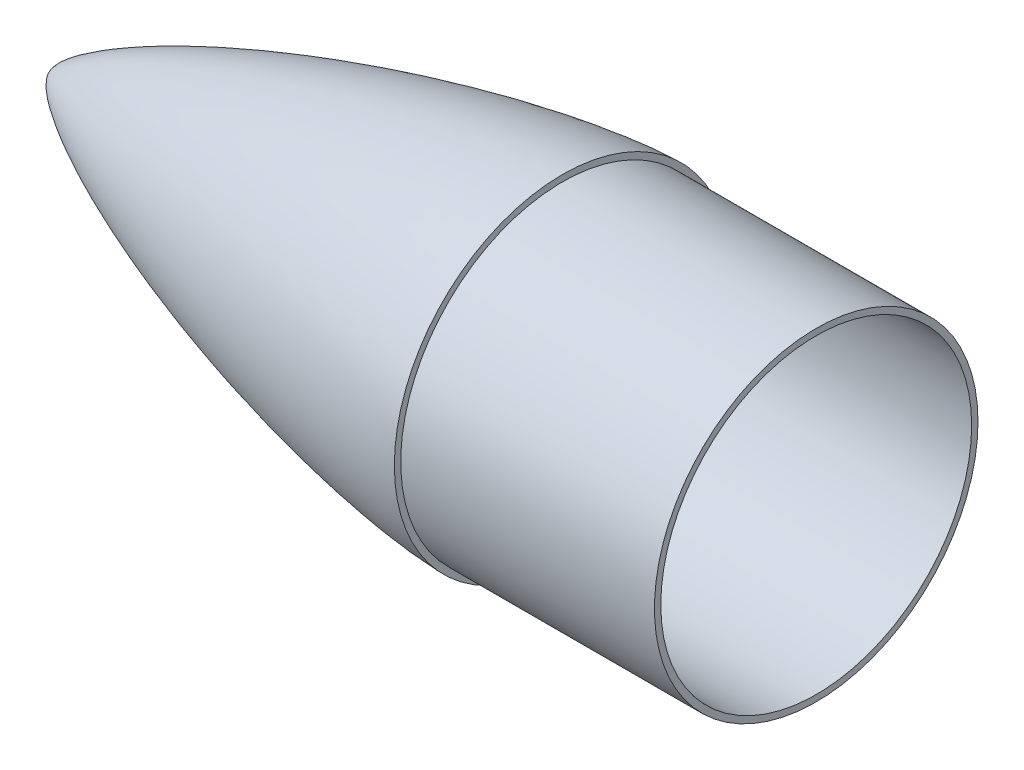
ISO-10303-21;
HEADER;
FILE_DESCRIPTION(('STEP AP214'),'2;1');
FILE_NAME('part.step','',(''),(''),'','','');
FILE_SCHEMA(('AUTOMOTIVE_DESIGN { 1 0 10303 214 1 1 1 1 }'));
ENDSEC;
DATA;
#1=APPLICATION_CONTEXT('core data for automotive mechanical design processes');
#2=APPLICATION_PROTOCOL_DEFINITION('international standard','automotive_design',2000,#1);
#3=PRODUCT_CONTEXT('',#1,'mechanical');
#4=PRODUCT('Part','Part','',(#3));
#5=PRODUCT_RELATED_PRODUCT_CATEGORY('part','',(#4));
#6=PRODUCT_DEFINITION_FORMATION('','',#4);
#7=PRODUCT_DEFINITION_CONTEXT('part definition',#1,'design');
#8=PRODUCT_DEFINITION('design','',#6,#7);
#9=PRODUCT_DEFINITION_SHAPE('','',#8);
#10=(LENGTH_UNIT() NAMED_UNIT(*) SI_UNIT(.MILLI.,.METRE.));
#11=(NAMED_UNIT(*) PLANE_ANGLE_UNIT() SI_UNIT($,.RADIAN.));
#12=(NAMED_UNIT(*) SI_UNIT($,.STERADIAN.) SOLID_ANGLE_UNIT());
#13=UNCERTAINTY_MEASURE_WITH_UNIT(LENGTH_MEASURE(1.E-05),#10,'distance_accuracy_value','');
#14=(GEOMETRIC_REPRESENTATION_CONTEXT(3) GLOBAL_UNCERTAINTY_ASSIGNED_CONTEXT((#13)) GLOBAL_UNIT_ASSIGNED_CONTEXT((#10,
#11,#12)) REPRESENTATION_CONTEXT('',''));
#15=CARTESIAN_POINT('',(0.,0.,0.));
#16=DIRECTION('',(0.,0.,1.));
#17=DIRECTION('',(1.,0.,0.));
#18=AXIS2_PLACEMENT_3D('',#15,#16,#17);
#19=CARTESIAN_POINT('',(20.,0.,0.));
#20=DIRECTION('',(-1.,0.,0.));
#21=DIRECTION('',(0.,0.,1.));
#22=AXIS2_PLACEMENT_3D('',#19,#20,#21);
#23=CYLINDRICAL_SURFACE('',#22,12.75);
#24=CARTESIAN_POINT('',(20.,0.,0.));
#25=DIRECTION('',(1.,0.,0.));
#26=DIRECTION('',(0.,0.,-1.));
#27=AXIS2_PLACEMENT_3D('',#24,#25,#26);
#28=CIRCLE('',#27,12.75);
#29=CARTESIAN_POINT('',(20.,0.,-12.75));
#30=VERTEX_POINT('',#29);
#31=EDGE_CURVE('E12',#30,#30,#28,.T.);
#32=ORIENTED_EDGE('',*,*,#31,.F.);
#33=EDGE_LOOP('',(#32));
#34=FACE_BOUND('',#33,.T.);
#35=CARTESIAN_POINT('',(0.,0.,0.));
#36=DIRECTION('',(1.,0.,0.));
#37=DIRECTION('',(0.,0.,-1.));
#38=AXIS2_PLACEMENT_3D('',#35,#36,#37);
#39=CIRCLE('',#38,12.75);
#40=CARTESIAN_POINT('',(0.,0.,-12.75));
#41=VERTEX_POINT('',#40);
#42=EDGE_CURVE('E88',#41,#41,#39,.T.);
#43=ORIENTED_EDGE('',*,*,#42,.T.);
#44=EDGE_LOOP('',(#43));
#45=FACE_BOUND('',#44,.T.);
#46=ADVANCED_FACE('F85',(#34,#45),#23,.T.);
#47=CARTESIAN_POINT('',(20.,0.,0.));
#48=DIRECTION('',(1.,0.,0.));
#49=DIRECTION('',(0.,0.,-1.));
#50=AXIS2_PLACEMENT_3D('',#47,#48,#49);
#51=PLANE('',#50);
#52=CARTESIAN_POINT('',(20.,0.,0.));
#53=DIRECTION('',(1.,0.,0.));
#54=DIRECTION('',(0.,0.,-1.));
#55=AXIS2_PLACEMENT_3D('',#52,#53,#54);
#56=CIRCLE('',#55,12.25);
#57=CARTESIAN_POINT('',(20.,0.,-12.25));
#58=VERTEX_POINT('',#57);
#59=EDGE_CURVE('E99',#58,#58,#56,.T.);
#60=ORIENTED_EDGE('',*,*,#59,.F.);
#61=EDGE_LOOP('',(#60));
#62=FACE_BOUND('',#61,.T.);
#63=ORIENTED_EDGE('',*,*,#31,.T.);
#64=EDGE_LOOP('',(#63));
#65=FACE_BOUND('',#64,.T.);
#66=ADVANCED_FACE('F106',(#62,#65),#51,.T.);
#67=CARTESIAN_POINT('',(0.,0.,0.));
#68=DIRECTION('',(1.,0.,0.));
#69=DIRECTION('',(0.,0.,-1.));
#70=AXIS2_PLACEMENT_3D('',#67,#68,#69);
#71=PLANE('',#70);
#72=CARTESIAN_POINT('',(0.,0.,0.));
#73=DIRECTION('',(1.,0.,0.));
#74=DIRECTION('',(0.,0.,-1.));
#75=AXIS2_PLACEMENT_3D('',#72,#73,#74);
#76=CIRCLE('',#75,12.25);
#77=CARTESIAN_POINT('',(0.,0.,-12.25));
#78=VERTEX_POINT('',#77);
#79=EDGE_CURVE('E95',#78,#78,#76,.F.);
#80=ORIENTED_EDGE('',*,*,#79,.F.);
#81=EDGE_LOOP('',(#80));
#82=FACE_BOUND('',#81,.T.);
#83=ORIENTED_EDGE('',*,*,#42,.F.);
#84=EDGE_LOOP('',(#83));
#85=FACE_BOUND('',#84,.T.);
#86=ADVANCED_FACE('F108',(#82,#85),#71,.F.);
#87=CARTESIAN_POINT('',(-40.0930989130625,0.,0.));
#88=DIRECTION('',(1.,0.,0.));
#89=DIRECTION('',(0.,0.,-1.));
#90=AXIS2_PLACEMENT_3D('',#87,#88,#89);
#91=CYLINDRICAL_SURFACE('',#90,12.25);
#92=CARTESIAN_POINT('',(20.,0.,-12.25));
#93=CARTESIAN_POINT('',(19.7916666666667,0.,-12.25));
#94=CARTESIAN_POINT('',(19.5833333333333,0.,-12.25));
#95=CARTESIAN_POINT('',(19.1666666666667,0.,-12.25));
#96=CARTESIAN_POINT('',(18.9583333333333,0.,-12.25));
#97=CARTESIAN_POINT('',(18.5416666666667,0.,-12.25));
#98=CARTESIAN_POINT('',(18.3333333333333,0.,-12.25));
#99=CARTESIAN_POINT('',(17.9166666666667,0.,-12.25));
#100=CARTESIAN_POINT('',(17.7083333333333,0.,-12.25));
#101=CARTESIAN_POINT('',(17.2916666666667,0.,-12.25));
#102=CARTESIAN_POINT('',(17.0833333333333,0.,-12.25));
#103=CARTESIAN_POINT('',(16.6666666666667,0.,-12.25));
#104=CARTESIAN_POINT('',(16.4583333333333,0.,-12.25));
#105=CARTESIAN_POINT('',(16.0416666666667,0.,-12.25));
#106=CARTESIAN_POINT('',(15.8333333333333,0.,-12.25));
#107=CARTESIAN_POINT('',(15.4166666666667,0.,-12.25));
#108=CARTESIAN_POINT('',(15.2083333333333,0.,-12.25));
#109=CARTESIAN_POINT('',(14.7916666666667,0.,-12.25));
#110=CARTESIAN_POINT('',(14.5833333333333,0.,-12.25));
#111=CARTESIAN_POINT('',(14.1666666666667,0.,-12.25));
#112=CARTESIAN_POINT('',(13.9583333333333,0.,-12.25));
#113=CARTESIAN_POINT('',(13.5416666666667,0.,-12.25));
#114=CARTESIAN_POINT('',(13.3333333333333,0.,-12.25));
#115=CARTESIAN_POINT('',(12.9166666666667,0.,-12.25));
#116=CARTESIAN_POINT('',(12.7083333333333,0.,-12.25));
#117=CARTESIAN_POINT('',(12.2916666666667,0.,-12.25));
#118=CARTESIAN_POINT('',(12.0833333333333,0.,-12.25));
#119=CARTESIAN_POINT('',(11.6666666666667,0.,-12.25));
#120=CARTESIAN_POINT('',(11.4583333333333,0.,-12.25));
#121=CARTESIAN_POINT('',(11.0416666666667,0.,-12.25));
#122=CARTESIAN_POINT('',(10.8333333333333,0.,-12.25));
#123=CARTESIAN_POINT('',(10.4166666666667,0.,-12.25));
#124=CARTESIAN_POINT('',(10.2083333333333,0.,-12.25));
#125=CARTESIAN_POINT('',(9.79166666666666,0.,-12.25));
#126=CARTESIAN_POINT('',(9.58333333333333,0.,-12.25));
#127=CARTESIAN_POINT('',(9.16666666666666,0.,-12.25));
#128=CARTESIAN_POINT('',(8.95833333333333,0.,-12.25));
#129=CARTESIAN_POINT('',(8.54166666666666,0.,-12.25));
#130=CARTESIAN_POINT('',(8.33333333333333,0.,-12.25));
#131=CARTESIAN_POINT('',(7.91666666666666,0.,-12.25));
#132=CARTESIAN_POINT('',(7.70833333333333,0.,-12.25));
#133=CARTESIAN_POINT('',(7.29166666666666,0.,-12.25));
#134=CARTESIAN_POINT('',(7.08333333333333,0.,-12.25));
#135=CARTESIAN_POINT('',(6.66666666666666,0.,-12.25));
#136=CARTESIAN_POINT('',(6.45833333333333,0.,-12.25));
#137=CARTESIAN_POINT('',(6.04166666666667,0.,-12.25));
#138=CARTESIAN_POINT('',(5.83333333333333,0.,-12.25));
#139=CARTESIAN_POINT('',(5.41666666666666,0.,-12.25));
#140=CARTESIAN_POINT('',(5.20833333333333,0.,-12.25));
#141=CARTESIAN_POINT('',(4.79166666666666,0.,-12.25));
#142=CARTESIAN_POINT('',(4.58333333333333,0.,-12.25));
#143=CARTESIAN_POINT('',(4.16666666666666,0.,-12.25));
#144=CARTESIAN_POINT('',(3.95833333333333,0.,-12.25));
#145=CARTESIAN_POINT('',(3.54166666666666,0.,-12.25));
#146=CARTESIAN_POINT('',(3.33333333333333,0.,-12.25));
#147=CARTESIAN_POINT('',(2.91666666666666,0.,-12.25));
#148=CARTESIAN_POINT('',(2.70833333333333,0.,-12.25));
#149=CARTESIAN_POINT('',(2.29166666666666,0.,-12.25));
#150=CARTESIAN_POINT('',(2.08333333333333,0.,-12.25));
#151=CARTESIAN_POINT('',(1.66666666666666,0.,-12.25));
#152=CARTESIAN_POINT('',(1.45833333333333,0.,-12.25));
#153=CARTESIAN_POINT('',(1.04166666666666,0.,-12.25));
#154=CARTESIAN_POINT('',(0.833333333333327,0.,-12.25));
#155=CARTESIAN_POINT('',(0.41666666666666,0.,-12.25));
#156=CARTESIAN_POINT('',(0.208333333333327,0.,-12.25));
#157=CARTESIAN_POINT('',(0.,0.,-12.25));
#158=B_SPLINE_CURVE_WITH_KNOTS('',3,(#92,#93,#94,#95,#96,#97,#98,#99,#100,#101,#102,#103,#104,
#105,#106,#107,#108,#109,#110,#111,#112,#113,#114,#115,#116,#117,#118,#119,#120,#121,#122,#123,
#124,#125,#126,#127,#128,#129,#130,#131,#132,#133,#134,#135,#136,#137,#138,#139,#140,#141,#142,
#143,#144,#145,#146,#147,#148,#149,#150,#151,#152,#153,#154,#155,#156,#157),.UNSPECIFIED.,.F.,
.F.,(4,2,2,2,2,2,2,2,2,2,2,2,2,2,2,2,2,2,2,2,2,2,2,2,2,2,2,2,2,2,2,2,4),(0.,0.625000000000001,
1.25,1.875,2.5,3.125,3.75,4.375,5.,5.62500000000001,6.25,6.875,7.5,8.125,8.75,9.375,10.,10.625,
11.25,11.875,12.5,13.125,13.75,14.375,15.,15.625,16.25,16.875,17.5,18.125,18.75,19.375,20.),.UNSPECIFIED.);
#159=EDGE_CURVE('BSEAM103',#58,#78,#158,.T.);
#160=ORIENTED_EDGE('',*,*,#59,.T.);
#161=ORIENTED_EDGE('',*,*,#79,.T.);
#162=ORIENTED_EDGE('',*,*,#159,.T.);
#163=ORIENTED_EDGE('',*,*,#159,.F.);
#164=EDGE_LOOP('',(#160,#162,#161,#163));
#165=FACE_BOUND('',#164,.T.);
#166=ADVANCED_FACE('F103',(#165),#91,.F.);
#167=CLOSED_SHELL('',(#46,#66,#86,#166));
#168=MANIFOLD_SOLID_BREP('B2',#167);
#169=CARTESIAN_POINT('',(-39.6100452831368,0.,0.));
#170=DIRECTION('',(1.,0.,0.));
#171=DIRECTION('',(0.,0.,-1.));
#172=AXIS2_PLACEMENT_3D('',#169,#170,#171);
#173=PLANE('',#172);
#174=CARTESIAN_POINT('',(-39.6100452831368,0.,0.));
#175=DIRECTION('',(1.,0.,0.));
#176=DIRECTION('',(0.,0.,-1.));
#177=AXIS2_PLACEMENT_3D('',#174,#175,#176);
#178=CIRCLE('',#177,0.338657604575159);
#179=CARTESIAN_POINT('',(-39.6100452831368,-0.146307802492929,-0.305422658076107));
#180=VERTEX_POINT('',#179);
#181=EDGE_CURVE('E84',#180,#180,#178,.T.);
#182=ORIENTED_EDGE('',*,*,#181,.T.);
#183=EDGE_LOOP('',(#182));
#184=FACE_BOUND('',#183,.T.);
#185=ADVANCED_FACE('F155',(#184),#173,.T.);
#186=CARTESIAN_POINT('',(-40.0803879721741,0.,0.));
#187=DIRECTION('',(1.,0.,0.));
#188=DIRECTION('',(0.,0.,-1.));
#189=AXIS2_PLACEMENT_3D('',#186,#187,#188);
#190=PLANE('',#189);
#191=CARTESIAN_POINT('',(-40.0803879721741,0.,0.));
#192=DIRECTION('',(1.,0.,0.));
#193=DIRECTION('',(0.,0.,-1.));
#194=AXIS2_PLACEMENT_3D('',#191,#192,#193);
#195=CIRCLE('',#194,0.500000000000001);
#196=CARTESIAN_POINT('',(-40.0803879721741,-0.335109697039272,-0.371081515236542));
#197=VERTEX_POINT('',#196);
#198=EDGE_CURVE('E163',#197,#197,#195,.T.);
#199=ORIENTED_EDGE('',*,*,#198,.F.);
#200=EDGE_LOOP('',(#199));
#201=FACE_BOUND('',#200,.T.);
#202=ADVANCED_FACE('F186',(#201),#190,.F.);
#203=CARTESIAN_POINT('',(-40.0803879721741,-0.335109697039272,-0.371081515236542));
#204=CARTESIAN_POINT('',(-40.1033067329983,-0.261435937402248,-0.289499362883331));
#205=CARTESIAN_POINT('',(-39.8566760080675,-0.203871869947589,-0.297461010479719));
#206=CARTESIAN_POINT('',(-39.6100452831368,-0.146307802492929,-0.305422658076107));
#207=CARTESIAN_POINT('',(-40.0803879721741,-0.32486942413107,-0.38032911882488));
#208=CARTESIAN_POINT('',(-40.1033072209954,-0.253416850845813,-0.296736045681893));
#209=CARTESIAN_POINT('',(-39.8566762520661,-0.195648142935301,-0.303098088685618));
#210=CARTESIAN_POINT('',(-39.6100452831368,-0.137879435024789,-0.309460131689342));
#211=CARTESIAN_POINT('',(-40.0803879721741,-0.30383073719376,-0.397818973483722));
#212=CARTESIAN_POINT('',(-40.1033103155206,-0.236923140608411,-0.310430673664126));
#213=CARTESIAN_POINT('',(-39.8566777993287,-0.178888304624512,-0.313602760163096));
#214=CARTESIAN_POINT('',(-39.6100452831368,-0.120853468640614,-0.316774846662065));
#215=CARTESIAN_POINT('',(-40.0803879721741,-0.270780615801149,-0.421046985526386));
#216=CARTESIAN_POINT('',(-40.1033102959687,-0.211154560421565,-0.328535309406903));
#217=CARTESIAN_POINT('',(-39.8566777895528,-0.153039008992214,-0.327021306913354));
#218=CARTESIAN_POINT('',(-39.6100452831368,-0.0949234575628625,-0.325507304419805));
#219=CARTESIAN_POINT('',(-40.0803879721741,-0.236420735797964,-0.441277515231353));
#220=CARTESIAN_POINT('',(-40.1033094809521,-0.184403532048194,-0.34429455999992));
#221=CARTESIAN_POINT('',(-39.8566773820445,-0.126561274937004,-0.338167894768014));
#222=CARTESIAN_POINT('',(-39.6100452831368,-0.0687190178258141,-0.332041229536107));
#223=CARTESIAN_POINT('',(-40.0803879721741,-0.0234968983718139,-0.544731525082386));
#224=CARTESIAN_POINT('',(-40.1032981416511,-0.0186868817919445,-0.424786635055151));
#225=CARTESIAN_POINT('',(-39.856671712394,0.0353837568535826,-0.391543355899931));
#226=CARTESIAN_POINT('',(-39.6100452831368,0.0894543954991096,-0.35830007674471));
#227=CARTESIAN_POINT('',(-40.0803879721741,0.223119857823136,-0.498954063570516));
#228=CARTESIAN_POINT('',(-40.1033060268777,0.172113591578821,-0.391653447522024));
#229=CARTESIAN_POINT('',(-39.8566756550073,0.206468335921579,-0.336407564752602));
#230=CARTESIAN_POINT('',(-39.6100452831368,0.240823080264337,-0.28116168198318));
#231=CARTESIAN_POINT('',(-40.0803879721741,0.46355755111992,-0.232706967957245));
#232=CARTESIAN_POINT('',(-40.103307804415,0.362881368925774,-0.180027878835511));
#233=CARTESIAN_POINT('',(-39.8566765437759,0.354339381567118,-0.121026003323516));
#234=CARTESIAN_POINT('',(-39.6100452831368,0.345797394208463,-0.0620241278115222));
#235=CARTESIAN_POINT('',(-40.0803879721741,0.547974371103313,0.0279126022972836));
#236=CARTESIAN_POINT('',(-40.1033042283759,0.426252178401426,0.021612043039057));
#237=CARTESIAN_POINT('',(-39.8566747557563,0.388387909749853,0.0725392046898485));
#238=CARTESIAN_POINT('',(-39.6100452831368,0.350523641098281,0.12346636634064));
#239=CARTESIAN_POINT('',(-40.0803879721741,0.4375124261213,0.278605479353163));
#240=CARTESIAN_POINT('',(-40.1033076379422,0.342510636709201,0.216294453154176));
#241=CARTESIAN_POINT('',(-39.8566764605395,0.286551056941769,0.240671187548963));
#242=CARTESIAN_POINT('',(-39.6100452831368,0.230591477174336,0.265047921943751));
#243=CARTESIAN_POINT('',(-40.0803879721741,0.232706967957245,0.46355755111992));
#244=CARTESIAN_POINT('',(-40.1033082963639,0.180274481026224,0.362766668015282));
#245=CARTESIAN_POINT('',(-39.8566767897504,0.121149304418873,0.354282031111872));
#246=CARTESIAN_POINT('',(-39.6100452831368,0.0620241278115222,0.345797394208463));
#247=CARTESIAN_POINT('',(-40.0803879721741,-0.0279126022972836,0.547974371103313));
#248=CARTESIAN_POINT('',(-40.1033062036409,-0.0219268875559384,0.426234241128132));
#249=CARTESIAN_POINT('',(-39.8566757433889,-0.0726966269482891,0.388378941113206));
#250=CARTESIAN_POINT('',(-39.6100452831368,-0.12346636634064,0.350523641098281));
#251=CARTESIAN_POINT('',(-40.0803879721741,-0.278605479353163,0.4375124261213));
#252=CARTESIAN_POINT('',(-40.1033067869025,-0.216065200012035,0.342636128329514));
#253=CARTESIAN_POINT('',(-39.8566760350197,-0.240556560977893,0.286613802751925));
#254=CARTESIAN_POINT('',(-39.6100452831368,-0.265047921943751,0.230591477174336));
#255=CARTESIAN_POINT('',(-40.0803879721741,-0.519043172649947,0.171265330508029));
#256=CARTESIAN_POINT('',(-40.1033120188757,-0.407130066534461,0.131326541075574));
#257=CARTESIAN_POINT('',(-39.8566786510063,-0.388576151211169,0.0713902320391261));
#258=CARTESIAN_POINT('',(-39.6100452831368,-0.370022235887877,0.0114539230026781));
#259=CARTESIAN_POINT('',(-40.0803879721741,-0.539524491226316,-0.0787265013744624));
#260=CARTESIAN_POINT('',(-40.1033201199947,-0.420591787450124,-0.0618063383654696));
#261=CARTESIAN_POINT('',(-39.8566827015658,-0.377929744126575,-0.108325069617348));
#262=CARTESIAN_POINT('',(-39.6100452831368,-0.335267700803026,-0.154843800869227));
#263=CARTESIAN_POINT('',(-40.0803879721741,-0.414970346067824,-0.280036107758193));
#264=CARTESIAN_POINT('',(-40.1033095700569,-0.323713938258788,-0.21852163041772));
#265=CARTESIAN_POINT('',(-39.8566774265968,-0.269695072809157,-0.24008269325474));
#266=CARTESIAN_POINT('',(-39.6100452831368,-0.215676207359527,-0.261643756091761));
#267=CARTESIAN_POINT('',(-40.0803879721741,-0.391353153655575,-0.312162481791682));
#268=CARTESIAN_POINT('',(-40.1033073941156,-0.305334374570618,-0.243526274676344));
#269=CARTESIAN_POINT('',(-39.8566763386262,-0.249748182306675,-0.260747479665809));
#270=CARTESIAN_POINT('',(-39.6100452831368,-0.194161990042732,-0.277968684655273));
#271=CARTESIAN_POINT('',(-40.0803879721741,-0.36488708063206,-0.342681296418637));
#272=CARTESIAN_POINT('',(-40.1033073875378,-0.284652365936106,-0.267358521337697));
#273=CARTESIAN_POINT('',(-39.8566763353373,-0.227879459489534,-0.280030218870357));
#274=CARTESIAN_POINT('',(-39.6100452831368,-0.171106553042963,-0.292701916403016));
#275=CARTESIAN_POINT('',(-40.0803879721741,-0.345349969947475,-0.361833911648204));
#276=CARTESIAN_POINT('',(-40.1033062450011,-0.269455023958683,-0.282262680084769));
#277=CARTESIAN_POINT('',(-39.856675764069,-0.212095596959876,-0.29182393227382));
#278=CARTESIAN_POINT('',(-39.6100452831368,-0.15473616996107,-0.301385184462871));
#279=CARTESIAN_POINT('',(-40.0803879721741,-0.335109697039272,-0.371081515236542));
#280=CARTESIAN_POINT('',(-40.1033067329983,-0.261435937402248,-0.289499362883331));
#281=CARTESIAN_POINT('',(-39.8566760080675,-0.203871869947589,-0.297461010479719));
#282=CARTESIAN_POINT('',(-39.6100452831368,-0.146307802492929,-0.305422658076107));
#283=B_SPLINE_SURFACE_WITH_KNOTS('',3,3,((#203,#204,#205,#206),(#207,#208,#209,#210),(#211,#212,
#213,#214),(#215,#216,#217,#218),(#219,#220,#221,#222),(#223,#224,#225,#226),(#227,#228,#229,
#230),(#231,#232,#233,#234),(#235,#236,#237,#238),(#239,#240,#241,#242),(#243,#244,#245,#246),
(#247,#248,#249,#250),(#251,#252,#253,#254),(#255,#256,#257,#258),(#259,#260,#261,#262),(#263,
#264,#265,#266),(#267,#268,#269,#270),(#271,#272,#273,#274),(#275,#276,#277,#278),(#279,#280,
#281,#282)),.UNSPECIFIED.,.T.,.F.,.F.,(4,1,1,1,1,2,1,2,1,2,1,1,1,1,4),(4,4),(0.,0.0125,
0.0249999999999999,0.0375000000000001,0.05,0.25,0.375,0.5,0.625,0.75,0.95,0.9625,0.975,0.9875,
1.),(0.,1.),.UNSPECIFIED.);
#284=CARTESIAN_POINT('',(-40.0803879721741,-0.335109697039272,-0.371081515236542));
#285=CARTESIAN_POINT('',(-40.0805654460272,-0.334539241114293,-0.370449820862224));
#286=CARTESIAN_POINT('',(-40.0807283436539,-0.333964569885281,-0.369817765125724));
#287=CARTESIAN_POINT('',(-40.0810209643011,-0.332817048447248,-0.368564508800024));
#288=CARTESIAN_POINT('',(-40.0811512023178,-0.33224433214934,-0.367943305611579));
#289=CARTESIAN_POINT('',(-40.0813787777868,-0.331100701367863,-0.36671166045326));
#290=CARTESIAN_POINT('',(-40.0814766011927,-0.330529900618531,-0.366101203114935));
#291=CARTESIAN_POINT('',(-40.0816396380271,-0.329390113167751,-0.364890983406496));
#292=CARTESIAN_POINT('',(-40.0817053030764,-0.328821219848816,-0.364291194153796));
#293=CARTESIAN_POINT('',(-40.0818043159467,-0.327685250838308,-0.363102234926807));
#294=CARTESIAN_POINT('',(-40.0818380762489,-0.327118249132344,-0.362513028835564));
#295=CARTESIAN_POINT('',(-40.0818735779394,-0.32598606810286,-0.361345159935872));
#296=CARTESIAN_POINT('',(-40.081875688244,-0.325420944677883,-0.360766454315583));
#297=CARTESIAN_POINT('',(-40.0818481923415,-0.324292522913487,-0.359619507154919));
#298=CARTESIAN_POINT('',(-40.0818189076906,-0.323729264224463,-0.359051219017802));
#299=CARTESIAN_POINT('',(-40.0817289279378,-0.322604572795352,-0.357925024746919));
#300=CARTESIAN_POINT('',(-40.0816685040166,-0.322043165736695,-0.357367071380433));
#301=CARTESIAN_POINT('',(-40.0815165545277,-0.320922175960799,-0.356261461302748));
#302=CARTESIAN_POINT('',(-40.0814252476734,-0.320362607614126,-0.355713760009179));
#303=CARTESIAN_POINT('',(-40.0812118429062,-0.319245290869468,-0.354628565396462));
#304=CARTESIAN_POINT('',(-40.0810899101701,-0.318687548469033,-0.354091033440664));
#305=CARTESIAN_POINT('',(-40.0808155649417,-0.317573876168019,-0.353026085502496));
#306=CARTESIAN_POINT('',(-40.0806632640944,-0.317017946994561,-0.352498640001869));
#307=CARTESIAN_POINT('',(-40.0803284935631,-0.315907890510763,-0.351453769815638));
#308=CARTESIAN_POINT('',(-40.0801460830694,-0.315353761798144,-0.350936327651497));
#309=CARTESIAN_POINT('',(-40.0797514027034,-0.314247292406134,-0.349911366109238));
#310=CARTESIAN_POINT('',(-40.0795391416607,-0.313694951247235,-0.349403843847205));
#311=CARTESIAN_POINT('',(-40.0790850671916,-0.312592040064624,-0.348398621609047));
#312=CARTESIAN_POINT('',(-40.0788432152392,-0.31204147332857,-0.347900935438938));
#313=CARTESIAN_POINT('',(-40.0783302626035,-0.310942091267775,-0.346915282899512));
#314=CARTESIAN_POINT('',(-40.0780590798101,-0.310393285532457,-0.346427348596848));
#315=CARTESIAN_POINT('',(-40.0774877650841,-0.30929740326379,-0.345461095865207));
#316=CARTESIAN_POINT('',(-40.0771875118218,-0.308750344767706,-0.34498282877598));
#317=CARTESIAN_POINT('',(-40.0765583511543,-0.307657932695547,-0.344035805669539));
#318=CARTESIAN_POINT('',(-40.0762292879702,-0.307112607310481,-0.343567120717238));
#319=CARTESIAN_POINT('',(-40.0755427975165,-0.306023635562766,-0.342639156768755));
#320=CARTESIAN_POINT('',(-40.0751851850084,-0.305480028786905,-0.342179968480899));
#321=CARTESIAN_POINT('',(-40.0744418808714,-0.304394467217136,-0.341270892956651));
#322=CARTESIAN_POINT('',(-40.0740559795762,-0.303852564186542,-0.340821115506752));
#323=CARTESIAN_POINT('',(-40.0732563777554,-0.302770382386642,-0.339930757433415));
#324=CARTESIAN_POINT('',(-40.0728424480553,-0.302230167901761,-0.339490304693637));
#325=CARTESIAN_POINT('',(-40.0719870644068,-0.301151335223532,-0.338618492891103));
#326=CARTESIAN_POINT('',(-40.0715453664551,-0.300612793786775,-0.338187278490767));
#327=CARTESIAN_POINT('',(-40.0706347166627,-0.299537279369455,-0.337333841608165));
#328=CARTESIAN_POINT('',(-40.0701655103306,-0.299000395229755,-0.336911778993711));
#329=CARTESIAN_POINT('',(-40.069200109888,-0.297928168031205,-0.336076545546167));
#330=CARTESIAN_POINT('',(-40.0687036547316,-0.297392925231739,-0.33566354803893));
#331=CARTESIAN_POINT('',(-40.0676840189344,-0.296323954061007,-0.33484634644305));
#332=CARTESIAN_POINT('',(-40.0671605741798,-0.295790336486817,-0.334442327292086));
#333=CARTESIAN_POINT('',(-40.0660872181258,-0.294724590036247,-0.333642985898663));
#334=CARTESIAN_POINT('',(-40.0655370426686,-0.294192581459312,-0.3332478583269));
#335=CARTESIAN_POINT('',(-40.0644104812651,-0.293130028334747,-0.332466205449845));
#336=CARTESIAN_POINT('',(-40.0638338336825,-0.292599612454667,-0.332079882692565));
#337=CARTESIAN_POINT('',(-40.0626545816588,-0.291540221202784,-0.33131574663354));
#338=CARTESIAN_POINT('',(-40.0620517202291,-0.29101138168214,-0.330938141969059));
#339=CARTESIAN_POINT('',(-40.0608202921522,-0.289955120814351,-0.33019135103767));
#340=CARTESIAN_POINT('',(-40.0601914748812,-0.289427841308179,-0.329822377810475));
#341=CARTESIAN_POINT('',(-40.0589083851733,-0.288374679320848,-0.329092760340174));
#342=CARTESIAN_POINT('',(-40.0582538698236,-0.287848943500351,-0.328732331977268));
#343=CARTESIAN_POINT('',(-40.0569196327804,-0.286798848891379,-0.328019716337312));
#344=CARTESIAN_POINT('',(-40.0562396769014,-0.286274640462146,-0.327667746358613));
#345=CARTESIAN_POINT('',(-40.0548548067107,-0.285227581744086,-0.32697196096253));
#346=CARTESIAN_POINT('',(-40.054149667669,-0.284704884459399,-0.326628362986343));
#347=CARTESIAN_POINT('',(-40.0527146784281,-0.283660830169483,-0.325949236297445));
#348=CARTESIAN_POINT('',(-40.0519846134358,-0.283139627839404,-0.32561392404197));
#349=CARTESIAN_POINT('',(-40.0505000191678,-0.282098546546834,-0.32495128457642));
#350=CARTESIAN_POINT('',(-40.0497452853095,-0.281578823043706,-0.324624171858205));
#351=CARTESIAN_POINT('',(-40.0482115999777,-0.280540683354645,-0.323977848186129));
#352=CARTESIAN_POINT('',(-40.047432454234,-0.280022422615763,-0.32365884891629));
#353=CARTESIAN_POINT('',(-40.0458501917552,-0.278987193176398,-0.323028669661392));
#354=CARTESIAN_POINT('',(-40.0450468910243,-0.27847037920438,-0.322717697840249));
#355=CARTESIAN_POINT('',(-40.04341656528,-0.277438028702461,-0.322103491678305));
#356=CARTESIAN_POINT('',(-40.0425893663961,-0.276922645563979,-0.321800461389062));
#357=CARTESIAN_POINT('',(-40.0409114912423,-0.275893142729148,-0.321202057045625));
#358=CARTESIAN_POINT('',(-40.0400606509913,-0.275379174552372,-0.320906882447467));
#359=CARTESIAN_POINT('',(-40.0383357402668,-0.274352488155573,-0.320324108695039));
#360=CARTESIAN_POINT('',(-40.0374615153998,-0.27383991912681,-0.320036704016071));
#361=CARTESIAN_POINT('',(-40.0356900829327,-0.272816017979025,-0.319469389670966));
#362=CARTESIAN_POINT('',(-40.0347927301771,-0.272304832338799,-0.319189669201182));
#363=CARTESIAN_POINT('',(-40.0329752897905,-0.271283685289308,-0.318637643120233));
#364=CARTESIAN_POINT('',(-40.0320550658593,-0.270773867328181,-0.318365521204752));
#365=CARTESIAN_POINT('',(-40.030192131376,-0.269755443262512,-0.317828612281995));
#366=CARTESIAN_POINT('',(-40.0292492929748,-0.269246977316777,-0.317564003314653));
#367=CARTESIAN_POINT('',(-40.0273413782208,-0.268231245154465,-0.317042040478072));
#368=CARTESIAN_POINT('',(-40.0263761820542,-0.267724115601903,-0.316784858895463));
#369=CARTESIAN_POINT('',(-40.0244238008613,-0.266711044294164,-0.31627767110386));
#370=CARTESIAN_POINT('',(-40.0234365036373,-0.266205235549926,-0.31602783137987));
#371=CARTESIAN_POINT('',(-40.0214401698451,-0.265194794077317,-0.3155352476199));
#372=CARTESIAN_POINT('',(-40.0204310282789,-0.264690290590014,-0.315292664260734));
#373=CARTESIAN_POINT('',(-40.0183912557367,-0.263682447960136,-0.31481451354414));
#374=CARTESIAN_POINT('',(-40.0173605265531,-0.263179234208182,-0.314579101083846));
#375=CARTESIAN_POINT('',(-40.0152778291207,-0.262173959453457,-0.314115212444894));
#376=CARTESIAN_POINT('',(-40.0142257690563,-0.261672019941678,-0.313886885441368));
#377=CARTESIAN_POINT('',(-40.0121006606049,-0.260669282117237,-0.313437087934493));
#378=CARTESIAN_POINT('',(-40.0110275264094,-0.260168601373769,-0.313215760965931));
#379=CARTESIAN_POINT('',(-40.0088605208216,-0.259168369555464,-0.312779883663592));
#380=CARTESIAN_POINT('',(-40.0077665692586,-0.258668932128921,-0.312565471325358));
#381=CARTESIAN_POINT('',(-40.0055581804294,-0.257671175411456,-0.312143343316087));
#382=CARTESIAN_POINT('',(-40.0044436682768,-0.257172965868377,-0.311935760217968));
#383=CARTESIAN_POINT('',(-40.0021944101126,-0.256177653363591,-0.311527210604614));
#384=CARTESIAN_POINT('',(-40.0010595941632,-0.255680656286151,-0.311326371368422));
#385=CARTESIAN_POINT('',(-39.9987699805823,-0.254687757121423,-0.310931229266561));
#386=CARTESIAN_POINT('',(-39.9976151176433,-0.254191957105367,-0.310737048524044));
#387=CARTESIAN_POINT('',(-39.9952856625754,-0.25320144042215,-0.310355143060562));
#388=CARTESIAN_POINT('',(-39.9941110094685,-0.252706822074976,-0.310167535451596));
#389=CARTESIAN_POINT('',(-39.9917422268541,-0.251718657027466,-0.30979869576342));
#390=CARTESIAN_POINT('',(-39.9905480404148,-0.251225204966801,-0.309617575934451));
#391=CARTESIAN_POINT('',(-39.9881404442055,-0.250239360720716,-0.309261631167406));
#392=CARTESIAN_POINT('',(-39.9869269812829,-0.249747059572876,-0.309086913770107));
#393=CARTESIAN_POINT('',(-39.9844810854401,-0.248763505304342,-0.30874369307791));
#394=CARTESIAN_POINT('',(-39.9832486028964,-0.248272339703073,-0.308575292768032));
#395=CARTESIAN_POINT('',(-39.9807649213913,-0.247291044597628,-0.308244625311391));
#396=CARTESIAN_POINT('',(-39.9795136761011,-0.246800999182995,-0.308082456747784));
#397=CARTESIAN_POINT('',(-39.9769927229142,-0.24582193243467,-0.307764171693594));
#398=CARTESIAN_POINT('',(-39.9757229717638,-0.24533299185208,-0.307608149537373));
#399=CARTESIAN_POINT('',(-39.9731652608843,-0.244356122662575,-0.307302076058006));
#400=CARTESIAN_POINT('',(-39.9718772607711,-0.243868271561922,-0.307152114971847));
#401=CARTESIAN_POINT('',(-39.9692833061966,-0.242893569139865,-0.306858082244523));
#402=CARTESIAN_POINT('',(-39.9679773140288,-0.242406792174794,-0.306714096892067));
#403=CARTESIAN_POINT('',(-39.9653476297644,-0.241434225735068,-0.306431934098291));
#404=CARTESIAN_POINT('',(-39.9640239024601,-0.240948507562315,-0.306293839143648));
#405=CARTESIAN_POINT('',(-39.9613590025184,-0.239978046325447,-0.306023375468717));
#406=CARTESIAN_POINT('',(-39.960017797005,-0.239493371604289,-0.305891085576051));
#407=CARTESIAN_POINT('',(-39.9573181954057,-0.23852498479591,-0.305632150208612));
#408=CARTESIAN_POINT('',(-39.9559597686194,-0.238041338187664,-0.305505580041797));
#409=CARTESIAN_POINT('',(-39.9532259793882,-0.237074995038008,-0.305258002173456));
#410=CARTESIAN_POINT('',(-39.9518505882735,-0.236592361205622,-0.305137066395794));
#411=CARTESIAN_POINT('',(-39.9490831254425,-0.23562803094909,-0.304900675220776));
#412=CARTESIAN_POINT('',(-39.9476910269515,-0.23514639455677,-0.304785288494768));
#413=CARTESIAN_POINT('',(-39.9448904045585,-0.234184046431524,-0.304559913209606));
#414=CARTESIAN_POINT('',(-39.9434818556506,-0.233703392144418,-0.304449990196765));
#415=CARTESIAN_POINT('',(-39.9406485877385,-0.232742995392023,-0.304235460000034));
#416=CARTESIAN_POINT('',(-39.9392238453799,-0.232263307875965,-0.304130915360745));
#417=CARTESIAN_POINT('',(-39.9363584459967,-0.231304831741065,-0.303927059452818));
#418=CARTESIAN_POINT('',(-39.9349177671598,-0.230826095662333,-0.303827807846216));
#419=CARTESIAN_POINT('',(-39.9320207503581,-0.229869509392353,-0.303634455429055));
#420=CARTESIAN_POINT('',(-39.9305643920212,-0.229391709417478,-0.303540411512947));
#421=CARTESIAN_POINT('',(-39.927636271858,-0.228436982262367,-0.303357391789913));
#422=CARTESIAN_POINT('',(-39.9261644910048,-0.22796010305797,-0.303268470220711));
#423=CARTESIAN_POINT('',(-39.9232057815412,-0.227007204269961,-0.303095612396399));
#424=CARTESIAN_POINT('',(-39.9217188351605,-0.226531230502605,-0.303011727829077));
#425=CARTESIAN_POINT('',(-39.9187300504613,-0.225580129335996,-0.302848861109167));
#426=CARTESIAN_POINT('',(-39.9172281955468,-0.225105045672075,-0.302769928197238));
#427=CARTESIAN_POINT('',(-39.9142098496804,-0.22415571138304,-0.302616881788367));
#428=CARTESIAN_POINT('',(-39.9126933432301,-0.223681502488682,-0.302542815183868));
#429=CARTESIAN_POINT('',(-39.9096459502683,-0.222733904335096,-0.302399418293511));
#430=CARTESIAN_POINT('',(-39.9081150492843,-0.222260554876073,-0.302330132647001));
#431=CARTESIAN_POINT('',(-39.9050391233018,-0.221314662117352,-0.302196214483371));
#432=CARTESIAN_POINT('',(-39.9034940847901,-0.220842156759021,-0.302131624443943));
#433=CARTESIAN_POINT('',(-39.9003901398648,-0.219897938655983,-0.302007014215898));
#434=CARTESIAN_POINT('',(-39.898831220835,-0.219426262063232,-0.301947034431194));
#435=CARTESIAN_POINT('',(-39.8956997710471,-0.218483687877963,-0.301831561348159));
#436=CARTESIAN_POINT('',(-39.8941272285122,-0.218012824715165,-0.30177610646439));
#437=CARTESIAN_POINT('',(-39.8909687879448,-0.217071863710905,-0.301669599736283));
#438=CARTESIAN_POINT('',(-39.8893828789207,-0.216601798641887,-0.301618584398262));
#439=CARTESIAN_POINT('',(-39.8861979616591,-0.215662420082929,-0.301520873235433));
#440=CARTESIAN_POINT('',(-39.8845989431647,-0.215193137770945,-0.301474212086601));
#441=CARTESIAN_POINT('',(-39.8813880632965,-0.214255310922533,-0.301385125699775));
#442=CARTESIAN_POINT('',(-39.8797761923533,-0.213786796030245,-0.301342733382239));
#443=CARTESIAN_POINT('',(-39.8765398639681,-0.212850490158492,-0.301262100982468));
#444=CARTESIAN_POINT('',(-39.8749153976004,-0.212382727347963,-0.301223892137038));
#445=CARTESIAN_POINT('',(-39.8716541347898,-0.21144791171977,-0.301151542935655));
#446=CARTESIAN_POINT('',(-39.8700173300239,-0.21098088565245,-0.301117432201883));
#447=CARTESIAN_POINT('',(-39.8667316468812,-0.210047529535435,-0.301053195410463));
#448=CARTESIAN_POINT('',(-39.8650827607458,-0.209581224872165,-0.301023097426682));
#449=CARTESIAN_POINT('',(-39.8617731713661,-0.208649297534604,-0.300966802257012));
#450=CARTESIAN_POINT('',(-39.8601124608919,-0.208183698935611,-0.300940631660377));
#451=CARTESIAN_POINT('',(-39.8567794793718,-0.207253169646372,-0.300892107324419));
#452=CARTESIAN_POINT('',(-39.8551072015914,-0.206788261771273,-0.300869778750949));
#453=CARTESIAN_POINT('',(-39.8517513420291,-0.20585909979977,-0.30082885446082));
#454=CARTESIAN_POINT('',(-39.8500677539767,-0.205394867307588,-0.30081028254544));
#455=CARTESIAN_POINT('',(-39.8466895304718,-0.204467041923726,-0.300776787513382));
#456=CARTESIAN_POINT('',(-39.8449948891834,-0.204003469472883,-0.300761886889963));
#457=CARTESIAN_POINT('',(-39.8415948158367,-0.203076949947022,-0.300735650328327));
#458=CARTESIAN_POINT('',(-39.83988937835,-0.202614022195365,-0.300724335629724));
#459=CARTESIAN_POINT('',(-39.8364679692635,-0.201688777798274,-0.30070518675095));
#460=CARTESIAN_POINT('',(-39.8347519926174,-0.201226479403076,-0.300697372609049));
#461=CARTESIAN_POINT('',(-39.8313097618944,-0.2003024794059,-0.300685140625648));
#462=CARTESIAN_POINT('',(-39.8295835031292,-0.19984079502388,-0.300680741671399));
#463=CARTESIAN_POINT('',(-39.826120964874,-0.198918008698106,-0.300675255795942));
#464=CARTESIAN_POINT('',(-39.8243846810312,-0.198456922985439,-0.300674186659398));
#465=CARTESIAN_POINT('',(-39.8209023493492,-0.197535319602866,-0.300675276104503));
#466=CARTESIAN_POINT('',(-39.8191562974716,-0.197074817215202,-0.300677451414862));
#467=CARTESIAN_POINT('',(-39.815654686469,-0.196154366047916,-0.300684945393179));
#468=CARTESIAN_POINT('',(-39.8138991236004,-0.195694431640388,-0.300690279778818));
#469=CARTESIAN_POINT('',(-39.8103787473843,-0.194775101960734,-0.300704007503025));
#470=CARTESIAN_POINT('',(-39.8086139305696,-0.194315720187985,-0.300712415591536));
#471=CARTESIAN_POINT('',(-39.805075303248,-0.193397481268546,-0.300732206274326));
#472=CARTESIAN_POINT('',(-39.8033014895331,-0.192938636784734,-0.300743602692549));
#473=CARTESIAN_POINT('',(-39.7997451252148,-0.19202145789831,-0.300769285546628));
#474=CARTESIAN_POINT('',(-39.7979625716463,-0.191563135357133,-0.300783584920689));
#475=CARTESIAN_POINT('',(-39.7943889844407,-0.190646985776723,-0.300814989158764));
#476=CARTESIAN_POINT('',(-39.7925979480663,-0.190189169831431,-0.300832106114103));
#477=CARTESIAN_POINT('',(-39.7890076520837,-0.189274018830214,-0.300869060948882));
#478=CARTESIAN_POINT('',(-39.7872083899515,-0.188816694133625,-0.300888910110288));
#479=CARTESIAN_POINT('',(-39.7836018993027,-0.187902510984947,-0.300931244754471));
#480=CARTESIAN_POINT('',(-39.781794668462,-0.187445662189467,-0.30095374074611));
#481=CARTESIAN_POINT('',(-39.7781724972584,-0.186532416166824,-0.301001284412389));
#482=CARTESIAN_POINT('',(-39.7763575547588,-0.186076027924459,-0.301026341857837));
#483=CARTESIAN_POINT('',(-39.7727202171125,-0.185163688301485,-0.301078923758889));
#484=CARTESIAN_POINT('',(-39.7708978200044,-0.184707745263862,-0.301106457281156));
#485=CARTESIAN_POINT('',(-39.7672458300278,-0.183796281314318,-0.301163906629643));
#486=CARTESIAN_POINT('',(-39.7654162353623,-0.183340768132697,-0.301193830851207));
#487=CARTESIAN_POINT('',(-39.7617501071686,-0.182430149130458,-0.301255976859773));
#488=CARTESIAN_POINT('',(-39.7599135719971,-0.181975050455748,-0.301288206402599));
#489=CARTESIAN_POINT('',(-39.7562338196997,-0.181065245674794,-0.301354878283868));
#490=CARTESIAN_POINT('',(-39.7543906010744,-0.180610546157573,-0.30138932776944));
#491=CARTESIAN_POINT('',(-39.7506977387872,-0.179701524871982,-0.301460354736015));
#492=CARTESIAN_POINT('',(-39.7488480937606,-0.179247209162506,-0.301496938785359));
#493=CARTESIAN_POINT('',(-39.7451426355981,-0.178338940646441,-0.301572150049821));
#494=CARTESIAN_POINT('',(-39.7432868212231,-0.177884993394662,-0.301610783283528));
#495=CARTESIAN_POINT('',(-39.7395692813001,-0.176977446922368,-0.301690008058435));
#496=CARTESIAN_POINT('',(-39.7377075546302,-0.176523852777951,-0.301730605096686));
#497=CARTESIAN_POINT('',(-39.7339784470617,-0.175616997623746,-0.301813672594572));
#498=CARTESIAN_POINT('',(-39.7321110651507,-0.175163741236078,-0.301856148057159));
#499=CARTESIAN_POINT('',(-39.7283709040522,-0.174257546674345,-0.301942887490535));
#500=CARTESIAN_POINT('',(-39.7264981239543,-0.173804612692556,-0.301987155996886));
#501=CARTESIAN_POINT('',(-39.7227474234415,-0.17289904799774,-0.302077396578238));
#502=CARTESIAN_POINT('',(-39.7208695022112,-0.172446421070712,-0.302123372747434));
#503=CARTESIAN_POINT('',(-39.7171087764003,-0.17154145551731,-0.302216943689226));
#504=CARTESIAN_POINT('',(-39.7152259710925,-0.17108912029369,-0.302264542140024));
#505=CARTESIAN_POINT('',(-39.7114557340997,-0.170184723156254,-0.302361272654697));
#506=CARTESIAN_POINT('',(-39.7095683017695,-0.169732664284474,-0.30241040800555));
#507=CARTESIAN_POINT('',(-39.7057890677115,-0.168828804837599,-0.302510127305521));
#508=CARTESIAN_POINT('',(-39.7038972654143,-0.168377006965879,-0.302560714174596));
#509=CARTESIAN_POINT('',(-39.7001095484079,-0.1674736544842,-0.302663251472262));
#510=CARTESIAN_POINT('',(-39.6982136331994,-0.167022102260572,-0.30271520447746));
#511=CARTESIAN_POINT('',(-39.6944179473617,-0.166119226018763,-0.302820388985194));
#512=CARTESIAN_POINT('',(-39.6925181762978,-0.165667904091075,-0.302873622744168));
#513=CARTESIAN_POINT('',(-39.6887150357459,-0.164765473363844,-0.302981283674325));
#514=CARTESIAN_POINT('',(-39.6868116658827,-0.164314366379776,-0.303035712804498));
#515=CARTESIAN_POINT('',(-39.6830015847342,-0.163412350441861,-0.303145679369413));
#516=CARTESIAN_POINT('',(-39.681094873128,-0.162961443048937,-0.303201218487993));
#517=CARTESIAN_POINT('',(-39.6772783655004,-0.162059811175105,-0.303313319899983));
#518=CARTESIAN_POINT('',(-39.6753685692077,-0.161609088020705,-0.303369883623983));
#519=CARTESIAN_POINT('',(-39.6715461492189,-0.160707809485747,-0.303483949095348));
#520=CARTESIAN_POINT('',(-39.6696335252964,-0.160257255217119,-0.303541452041601));
#521=CARTESIAN_POINT('',(-39.6658057070642,-0.159356299295844,-0.303657310784624));
#522=CARTESIAN_POINT('',(-39.6638905125686,-0.158905898560114,-0.3037156675698));
#523=CARTESIAN_POINT('',(-39.6600578102111,-0.158005234527357,-0.303833148796749));
#524=CARTESIAN_POINT('',(-39.6581403021995,-0.157554971971545,-0.303892274037371));
#525=CARTESIAN_POINT('',(-39.6543032298348,-0.156654569102155,-0.304011206960502));
#526=CARTESIAN_POINT('',(-39.6523836653641,-0.156204429373177,-0.304071015272957));
#527=CARTESIAN_POINT('',(-39.6485427371104,-0.15530425694202,-0.304191229104517));
#528=CARTESIAN_POINT('',(-39.6466213732379,-0.154854224686719,-0.304251635105087));
#529=CARTESIAN_POINT('',(-39.6427771032137,-0.153954251968655,-0.304372959057288));
#530=CARTESIAN_POINT('',(-39.6408541969965,-0.153504311833762,-0.304433877362116));
#531=CARTESIAN_POINT('',(-39.6370070993201,-0.152604508103749,-0.304556140647258));
#532=CARTESIAN_POINT('',(-39.6350829078155,-0.152154644736053,-0.304617485872536));
#533=CARTESIAN_POINT('',(-39.6312334966056,-0.15125497926873,-0.304740517702542));
#534=CARTESIAN_POINT('',(-39.6293082768712,-0.150805177314516,-0.304802204463884));
#535=CARTESIAN_POINT('',(-39.6254570662459,-0.149905619385751,-0.304925834052053));
#536=CARTESIAN_POINT('',(-39.6235310753386,-0.149455863492936,-0.304987776966904));
#537=CARTESIAN_POINT('',(-39.6196785794178,-0.148556382374043,-0.305111833521366));
#538=CARTESIAN_POINT('',(-39.6177520743971,-0.148106657184273,-0.305173947200076));
#539=CARTESIAN_POINT('',(-39.6138988072941,-0.147207222163597,-0.305298259948233));
#540=CARTESIAN_POINT('',(-39.61197204521,-0.146757512341767,-0.305360459027455));
#541=CARTESIAN_POINT('',(-39.6100452831368,-0.146307802492929,-0.305422658076107));
#542=B_SPLINE_CURVE_WITH_KNOTS('',3,(#284,#285,#286,#287,#288,#289,#290,#291,#292,#293,#294,
#295,#296,#297,#298,#299,#300,#301,#302,#303,#304,#305,#306,#307,#308,#309,#310,#311,#312,#313,
#314,#315,#316,#317,#318,#319,#320,#321,#322,#323,#324,#325,#326,#327,#328,#329,#330,#331,#332,
#333,#334,#335,#336,#337,#338,#339,#340,#341,#342,#343,#344,#345,#346,#347,#348,#349,#350,#351,
#352,#353,#354,#355,#356,#357,#358,#359,#360,#361,#362,#363,#364,#365,#366,#367,#368,#369,#370,
#371,#372,#373,#374,#375,#376,#377,#378,#379,#380,#381,#382,#383,#384,#385,#386,#387,#388,#389,
#390,#391,#392,#393,#394,#395,#396,#397,#398,#399,#400,#401,#402,#403,#404,#405,#406,#407,#408,
#409,#410,#411,#412,#413,#414,#415,#416,#417,#418,#419,#420,#421,#422,#423,#424,#425,#426,#427,
#428,#429,#430,#431,#432,#433,#434,#435,#436,#437,#438,#439,#440,#441,#442,#443,#444,#445,#446,
#447,#448,#449,#450,#451,#452,#453,#454,#455,#456,#457,#458,#459,#460,#461,#462,#463,#464,#465,
#466,#467,#468,#469,#470,#471,#472,#473,#474,#475,#476,#477,#478,#479,#480,#481,#482,#483,#484,
#485,#486,#487,#488,#489,#490,#491,#492,#493,#494,#495,#496,#497,#498,#499,#500,#501,#502,#503,
#504,#505,#506,#507,#508,#509,#510,#511,#512,#513,#514,#515,#516,#517,#518,#519,#520,#521,#522,
#523,#524,#525,#526,#527,#528,#529,#530,#531,#532,#533,#534,#535,#536,#537,#538,#539,#540,#541),
.UNSPECIFIED.,.F.,.F.,(4,2,2,2,2,2,2,2,2,2,2,2,2,2,2,2,2,2,2,2,2,2,2,2,2,2,2,2,2,2,2,2,2,2,2,2,
2,2,2,2,2,2,2,2,2,2,2,2,2,2,2,2,2,2,2,2,2,2,2,2,2,2,2,2,2,2,2,2,2,2,2,2,2,2,2,2,2,2,2,2,2,2,2,2,
2,2,2,2,2,2,2,2,2,2,2,2,2,2,2,2,2,2,2,2,2,2,2,2,2,2,2,2,2,2,2,2,2,2,2,2,2,2,2,2,2,2,2,2,4),(0.,
0.00260831427861217,0.00517246596682753,0.00769622541744702,0.010183445992699,
0.0126380519268406,0.0150640241404167,0.0174653841598194,0.0198461763887915,0.0222104490677763,
0.024562234334794,0.0269055278604505,0.0292442685635434,0.0315823189188313,0.0339234463438001,
0.0362713060988422,0.0386294260601149,0.0410011936334238,0.0433898449786409,0.0457984566156264,
0.0482299393911374,0.0506870347072889,0.0531723128490954,0.0556881732029731,0.0582368461293744,
0.0608203962397728,0.063440726827775,0.0660995852147706,0.0687985687876089,0.0715391315285947,
0.0743225908624279,0.0771501346706084,0.0800228283486679,0.0829416218046436,0.0859073563186541,
0.0889207712017341,0.091982510208709,0.0950931276728416,0.0982530943418974,0.101462802903978,
0.104722573199238,0.108032657118889,0.111393243197659,0.114804460908881,0.118266384673787,
0.121779037598151,0.125342394950367,0.128956387395543,0.132620904000297,0.136335795022875,
0.140100874502801,0.143915922663652,0.147780688142267,0.151694890056712,0.155658219924757,
0.159670343444026,0.163730902144041,0.167839514919803,0.171995779455977,0.176199273549946,
0.180449556341356,0.184746169455489,0.189088638066814,0.193476471889017,0.197909166096943,
0.202386202185654,0.206907048771541,0.211471162339537,0.216077987940774,0.220726959844269,
0.225417502145995,0.230149029338623,0.234920946844776,0.239732651516392,0.244583532102773,
0.249472969689517,0.254400338110426,0.259365004334359,0.264366328828748,0.26940366590144,
0.274476364022433,0.279583766126785,0.284725209900151,0.289900028047974,0.295107548549567,
0.300347094898066,0.305617986327142,0.310919538025535,0.316251061339947,0.321611863967367,
0.327001250137226,0.332418520784327,0.337862973712881,0.343333903752476,0.348830602906291,
0.354352360492214,0.359898463277176,0.365468195605236,0.371060839519805,0.376675674880312,
0.382311979473786,0.387969029121519,0.393646097781256,0.399342457645171,0.405057379233847,
0.410790131486537,0.416539981848041,0.422306196352223,0.428088039702619,0.433884775350115,
0.439695665568098,0.445519971525104,0.451356953355144,0.457205870226014,0.46306598040557,
0.468936541326209,0.474816809647711,0.480706041318526,0.486603491635622,0.492508415303136,
0.498420066489853,0.504337698885554,0.510260565756563,0.516187920000434,0.522119014199905,
0.528053100676252,0.533989431542239,0.539927258754527,0.545865834165917),.UNSPECIFIED.);
#543=EDGE_CURVE('BSEAM194',#197,#180,#542,.T.);
#544=ORIENTED_EDGE('',*,*,#198,.T.);
#545=ORIENTED_EDGE('',*,*,#181,.F.);
#546=ORIENTED_EDGE('',*,*,#543,.T.);
#547=ORIENTED_EDGE('',*,*,#543,.F.);
#548=EDGE_LOOP('',(#544,#546,#545,#547));
#549=FACE_BOUND('',#548,.T.);
#550=ADVANCED_FACE('F194',(#549),#283,.T.);
#551=CLOSED_SHELL('',(#185,#202,#550));
#552=MANIFOLD_SOLID_BREP('B7',#551);
#553=CARTESIAN_POINT('',(0.,13.25,0.));
#554=CARTESIAN_POINT('',(-0.266924450771589,13.2486670093395,0.));
#555=CARTESIAN_POINT('',(-1.15276147699282,13.214692045395,0.));
#556=CARTESIAN_POINT('',(-2.68604290925239,13.0948279291521,0.));
#557=CARTESIAN_POINT('',(-4.86043923136028,12.8411616198527,0.));
#558=CARTESIAN_POINT('',(-7.40475056646982,12.4560097368114,0.));
#559=CARTESIAN_POINT('',(-9.96842093235723,11.9939730988271,0.));
#560=CARTESIAN_POINT('',(-12.519885546707,11.4689080092887,0.));
#561=CARTESIAN_POINT('',(-15.0587889096959,10.8862975304457,0.));
#562=CARTESIAN_POINT('',(-17.5845367571327,10.2490882582951,0.));
#563=CARTESIAN_POINT('',(-20.0962234716923,9.55856543730369,0.));
#564=CARTESIAN_POINT('',(-22.5925891217991,8.81449389957737,0.));
#565=CARTESIAN_POINT('',(-25.0718125804933,8.01512229466037,0.));
#566=CARTESIAN_POINT('',(-27.53137279686,7.1569802464088,0.));
#567=CARTESIAN_POINT('',(-29.9674279229312,6.23408070506623,0.));
#568=CARTESIAN_POINT('',(-32.3742374953444,5.23692951991788,0.));
#569=CARTESIAN_POINT('',(-34.5108581308691,4.25518906131127,0.));
#570=CARTESIAN_POINT('',(-36.3050645900408,3.33209143956766,0.));
#571=CARTESIAN_POINT('',(-37.6634147650916,2.53884427642577,0.));
#572=CARTESIAN_POINT('',(-38.5507226489079,1.95428213932308,0.));
#573=CARTESIAN_POINT('',(-39.1563753012156,1.49965288381849,0.));
#574=CARTESIAN_POINT('',(-39.5342882503273,1.17554476150396,0.));
#575=CARTESIAN_POINT('',(-39.767298481548,0.945815359433693,0.));
#576=CARTESIAN_POINT('',(-39.9053957136563,0.788456667205023,0.));
#577=CARTESIAN_POINT('',(-39.9844562083329,0.683806356778252,0.));
#578=CARTESIAN_POINT('',(-40.0283322782635,0.616287828765711,0.));
#579=CARTESIAN_POINT('',(-40.0563340751102,0.565469693688566,0.));
#580=CARTESIAN_POINT('',(-40.0712316863339,0.533579820631572,0.));
#581=CARTESIAN_POINT('',(-40.0775712976235,0.513509565442361,0.));
#582=CARTESIAN_POINT('',(-40.0803879721741,0.500000000000001,0.));
#583=B_SPLINE_CURVE_WITH_KNOTS('',4,(#553,#554,#555,#556,#557,#558,#559,#560,#561,#562,#563,
#564,#565,#566,#567,#568,#569,#570,#571,#572,#573,#574,#575,#576,#577,#578,#579,#580,#581,#582),
.UNSPECIFIED.,.F.,.F.,(5,1,1,1,1,1,1,1,1,1,1,1,1,1,1,1,1,1,1,1,1,1,1,1,1,1,5),(0.,
0.0250439864427157,0.0831591324190282,0.144257987451829,0.205356847360646,0.266455707059715,
0.327554569096276,0.388653431574586,0.4497522844121,0.510851151842726,0.571950012903455,
0.633048855583422,0.694147710661217,0.755246568969043,0.816345433545614,0.877444252568857,
0.91471173386194,0.94448448094658,0.9638754408687,0.97708635395486,0.985723370644191,
0.991163099216567,0.994553490910568,0.996712252138848,0.998021745006914,0.998708589950527,1.),.UNSPECIFIED.);
#584=CARTESIAN_POINT('',(2.00000000000001,0.,0.));
#585=DIRECTION('',(1.,0.,0.));
#586=AXIS1_PLACEMENT('',#584,#585);
#587=SURFACE_OF_REVOLUTION('',#583,#586);
#588=CARTESIAN_POINT('',(-40.0803879721741,0.,0.));
#589=DIRECTION('',(1.,0.,0.));
#590=DIRECTION('',(0.,0.,-1.));
#591=AXIS2_PLACEMENT_3D('',#588,#589,#590);
#592=CIRCLE('',#591,0.500000000000001);
#593=CARTESIAN_POINT('',(-40.0803879721741,0.,-0.500000000000001));
#594=VERTEX_POINT('',#593);
#595=EDGE_CURVE('E265',#594,#594,#592,.T.);
#596=ORIENTED_EDGE('',*,*,#595,.T.);
#597=EDGE_LOOP('',(#596));
#598=FACE_BOUND('',#597,.T.);
#599=CARTESIAN_POINT('',(0.,0.,0.));
#600=DIRECTION('',(1.,0.,0.));
#601=DIRECTION('',(0.,0.,-1.));
#602=AXIS2_PLACEMENT_3D('',#599,#600,#601);
#603=CIRCLE('',#602,13.25);
#604=CARTESIAN_POINT('',(0.,0.,-13.25));
#605=VERTEX_POINT('',#604);
#606=EDGE_CURVE('E154',#605,#605,#603,.T.);
#607=ORIENTED_EDGE('',*,*,#606,.F.);
#608=EDGE_LOOP('',(#607));
#609=FACE_BOUND('',#608,.T.);
#610=ADVANCED_FACE('F249',(#598,#609),#587,.F.);
#611=CARTESIAN_POINT('',(0.,0.,0.));
#612=DIRECTION('',(-1.,0.,0.));
#613=DIRECTION('',(0.,0.,1.));
#614=AXIS2_PLACEMENT_3D('',#611,#612,#613);
#615=CONICAL_SURFACE('',#614,13.25,1.5658024808746);
#616=CARTESIAN_POINT('',(0.00249691258190831,0.,0.));
#617=DIRECTION('',(1.,0.,0.));
#618=DIRECTION('',(0.,0.,-1.));
#619=AXIS2_PLACEMENT_3D('',#616,#617,#618);
#620=CIRCLE('',#619,12.7500062346113);
#621=CARTESIAN_POINT('',(0.00249691258190831,0.,-12.7500062346113));
#622=VERTEX_POINT('',#621);
#623=EDGE_CURVE('E257',#622,#622,#620,.T.);
#624=ORIENTED_EDGE('',*,*,#623,.F.);
#625=EDGE_LOOP('',(#624));
#626=FACE_BOUND('',#625,.T.);
#627=ORIENTED_EDGE('',*,*,#606,.T.);
#628=EDGE_LOOP('',(#627));
#629=FACE_BOUND('',#628,.T.);
#630=ADVANCED_FACE('F284',(#626,#629),#615,.T.);
#631=CARTESIAN_POINT('',(0.0024969125819085,12.7500062346113,0.));
#632=CARTESIAN_POINT('',(-0.435177878682645,12.7478205359712,0.));
#633=CARTESIAN_POINT('',(-0.872294691416499,12.7220439254741,0.));
#634=CARTESIAN_POINT('',(-1.74552295867411,12.6622577921241,0.));
#635=CARTESIAN_POINT('',(-2.18159866968091,12.6246776509552,0.));
#636=CARTESIAN_POINT('',(-3.48818838488057,12.4960200036446,0.));
#637=CARTESIAN_POINT('',(-4.35712758430946,12.3893977134211,0.));
#638=CARTESIAN_POINT('',(-6.95771010880844,12.0262332471271,0.));
#639=CARTESIAN_POINT('',(-8.68317243951431,11.726718162007,0.));
#640=CARTESIAN_POINT('',(-13.8346268248151,10.705841430272,0.));
#641=CARTESIAN_POINT('',(-17.2366068327,9.86391373707261,0.));
#642=CARTESIAN_POINT('',(-22.2770425903036,8.38957355966981,0.));
#643=CARTESIAN_POINT('',(-23.9466415066366,7.86185472436647,0.));
#644=CARTESIAN_POINT('',(-27.2579611295897,6.72484365568506,0.));
#645=CARTESIAN_POINT('',(-28.9000813307249,6.11626585934336,0.));
#646=CARTESIAN_POINT('',(-32.1413763335991,4.79277104635715,0.));
#647=CARTESIAN_POINT('',(-33.7429730841833,4.08144033326758,0.));
#648=CARTESIAN_POINT('',(-36.0756330521116,2.8757806091609,0.));
#649=CARTESIAN_POINT('',(-36.8425144516326,2.4519749098367,0.));
#650=CARTESIAN_POINT('',(-37.9516444368697,1.74943654794815,0.));
#651=CARTESIAN_POINT('',(-38.3153008595913,1.50511944349882,0.));
#652=CARTESIAN_POINT('',(-38.8374132877389,1.10721118661906,0.));
#653=CARTESIAN_POINT('',(-39.008026476066,0.969734873702949,0.));
#654=CARTESIAN_POINT('',(-39.2515539124294,0.749672428319615,0.));
#655=CARTESIAN_POINT('',(-39.3307063311827,0.674155037226503,0.));
#656=CARTESIAN_POINT('',(-39.4435945602723,0.555035262354861,0.));
#657=CARTESIAN_POINT('',(-39.480255400939,0.514335618795381,0.));
#658=CARTESIAN_POINT('',(-39.5324478369384,0.451016838938501,0.));
#659=CARTESIAN_POINT('',(-39.5493096638037,0.429639354438349,0.));
#660=CARTESIAN_POINT('',(-39.573535382992,0.396526757223077,0.));
#661=CARTESIAN_POINT('',(-39.5814568391674,0.385272716000086,0.));
#662=CARTESIAN_POINT('',(-39.5927832193197,0.368168754360237,0.));
#663=CARTESIAN_POINT('',(-39.5964652663756,0.362420973075281,0.));
#664=CARTESIAN_POINT('',(-39.6017750760779,0.353645209934207,0.));
#665=CARTESIAN_POINT('',(-39.6035264148674,0.350678352413558,0.));
#666=CARTESIAN_POINT('',(-39.6060323607056,0.346203728417978,0.));
#667=CARTESIAN_POINT('',(-39.6068516250164,0.344696904749044,0.));
#668=CARTESIAN_POINT('',(-39.6084652753288,0.341682618546318,0.));
#669=CARTESIAN_POINT('',(-39.6108075594115,0.337127447053278,0.));
#670=CARTESIAN_POINT('',(-39.6100452831368,0.338657604575159,0.));
#671=B_SPLINE_CURVE_WITH_KNOTS('',3,(#631,#632,#633,#634,#635,#636,#637,#638,#639,#640,#641,
#642,#643,#644,#645,#646,#647,#648,#649,#650,#651,#652,#653,#654,#655,#656,#657,#658,#659,#660,
#661,#662,#663,#664,#665,#666,#667,#668,#669,#670),.UNSPECIFIED.,.F.,.F.,(4,2,2,2,2,2,2,2,2,2,2,
2,2,2,2,2,2,2,2,4),(0.,0.00131290878360876,0.00262581756721751,0.00525163513443503,
0.0105032702688701,0.0210065405377401,0.0262581756721751,0.0315098108066102,0.0367614459410452,
0.0393872635082627,0.0407001722918715,0.0413566266836758,0.041684853879578,0.0418489674775291,
0.0419310242765047,0.0419720526759925,0.0419925668757363,0.0420028239756083,0.0420079525255442,
0.0420130810754802),.UNSPECIFIED.);
#672=CARTESIAN_POINT('',(2.00000000000001,0.,0.));
#673=DIRECTION('',(1.,0.,0.));
#674=AXIS1_PLACEMENT('',#672,#673);
#675=SURFACE_OF_REVOLUTION('',#671,#674);
#676=CARTESIAN_POINT('',(-39.6100452831368,0.,0.));
#677=DIRECTION('',(1.,0.,0.));
#678=DIRECTION('',(0.,0.,-1.));
#679=AXIS2_PLACEMENT_3D('',#676,#677,#678);
#680=CIRCLE('',#679,0.338657604575159);
#681=CARTESIAN_POINT('',(-39.6100452831368,0.,-0.338657604575159));
#682=VERTEX_POINT('',#681);
#683=EDGE_CURVE('E261',#682,#682,#680,.T.);
#684=ORIENTED_EDGE('',*,*,#683,.F.);
#685=EDGE_LOOP('',(#684));
#686=FACE_BOUND('',#685,.T.);
#687=ORIENTED_EDGE('',*,*,#623,.T.);
#688=EDGE_LOOP('',(#687));
#689=FACE_BOUND('',#688,.T.);
#690=ADVANCED_FACE('F280',(#686,#689),#675,.T.);
#691=CARTESIAN_POINT('',(-39.6100452831368,0.,0.));
#692=DIRECTION('',(-1.,0.,0.));
#693=DIRECTION('',(0.,0.,1.));
#694=AXIS2_PLACEMENT_3D('',#691,#692,#693);
#695=CONICAL_SURFACE('',#694,0.338657604575159,0.330453434584875);
#696=ORIENTED_EDGE('',*,*,#595,.F.);
#697=EDGE_LOOP('',(#696));
#698=FACE_BOUND('',#697,.T.);
#699=ORIENTED_EDGE('',*,*,#683,.T.);
#700=EDGE_LOOP('',(#699));
#701=FACE_BOUND('',#700,.T.);
#702=ADVANCED_FACE('F283',(#698,#701),#695,.F.);
#703=CLOSED_SHELL('',(#610,#630,#690,#702));
#704=MANIFOLD_SOLID_BREP('B79',#703);
#705=ADVANCED_BREP_SHAPE_REPRESENTATION('',(#18,#168,#552,#704),#14);
#706=SHAPE_DEFINITION_REPRESENTATION(#9,#705);
ENDSEC;
END-ISO-10303-21;
